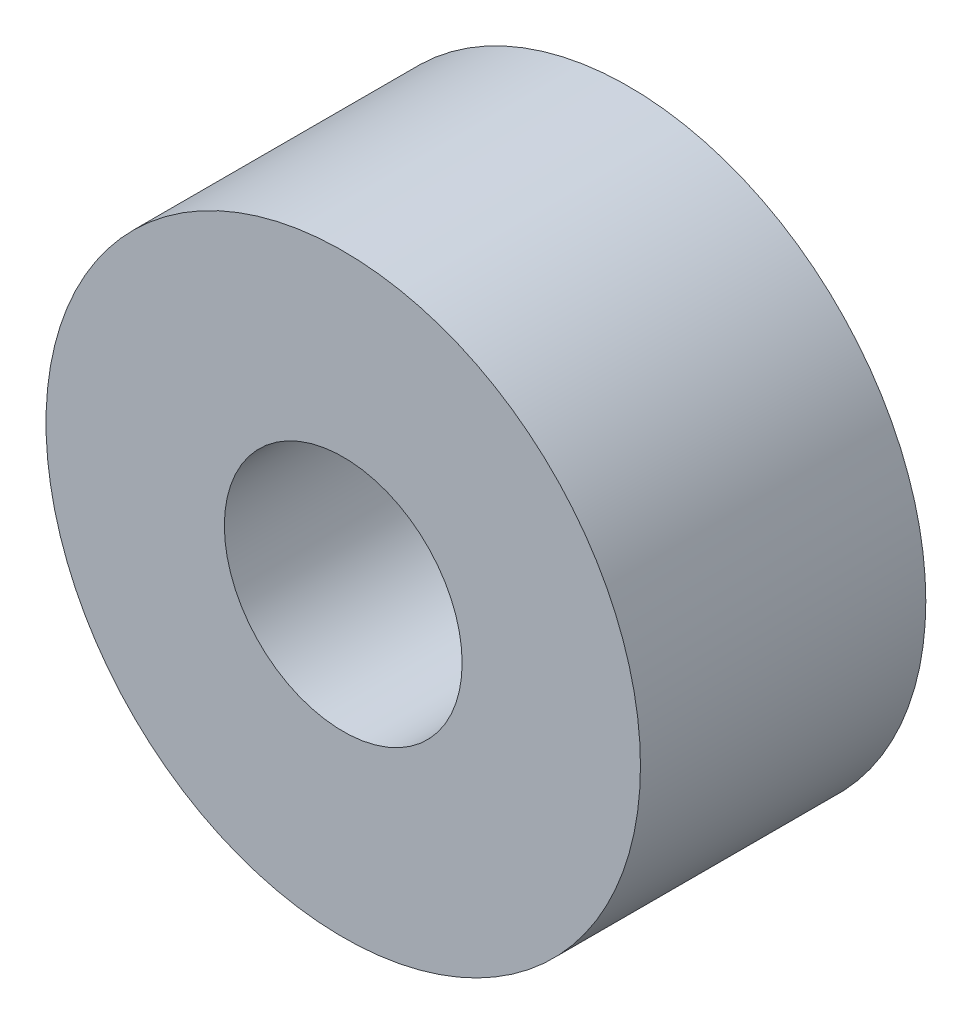
ISO-10303-21;
HEADER;
FILE_DESCRIPTION(('STEP AP214'),'2;1');
FILE_NAME('part.step','',(''),(''),'','','');
FILE_SCHEMA(('AUTOMOTIVE_DESIGN { 1 0 10303 214 1 1 1 1 }'));
ENDSEC;
DATA;
#1=APPLICATION_CONTEXT('core data for automotive mechanical design processes');
#2=APPLICATION_PROTOCOL_DEFINITION('international standard','automotive_design',2000,#1);
#3=PRODUCT_CONTEXT('',#1,'mechanical');
#4=PRODUCT('Part','Part','',(#3));
#5=PRODUCT_RELATED_PRODUCT_CATEGORY('part','',(#4));
#6=PRODUCT_DEFINITION_FORMATION('','',#4);
#7=PRODUCT_DEFINITION_CONTEXT('part definition',#1,'design');
#8=PRODUCT_DEFINITION('design','',#6,#7);
#9=PRODUCT_DEFINITION_SHAPE('','',#8);
#10=(LENGTH_UNIT() NAMED_UNIT(*) SI_UNIT(.MILLI.,.METRE.));
#11=(NAMED_UNIT(*) PLANE_ANGLE_UNIT() SI_UNIT($,.RADIAN.));
#12=(NAMED_UNIT(*) SI_UNIT($,.STERADIAN.) SOLID_ANGLE_UNIT());
#13=UNCERTAINTY_MEASURE_WITH_UNIT(LENGTH_MEASURE(1.E-05),#10,'distance_accuracy_value','');
#14=(GEOMETRIC_REPRESENTATION_CONTEXT(3) GLOBAL_UNCERTAINTY_ASSIGNED_CONTEXT((#13)) GLOBAL_UNIT_ASSIGNED_CONTEXT((#10,
#11,#12)) REPRESENTATION_CONTEXT('',''));
#15=CARTESIAN_POINT('',(0.,0.,0.));
#16=DIRECTION('',(0.,0.,1.));
#17=DIRECTION('',(1.,0.,0.));
#18=AXIS2_PLACEMENT_3D('',#15,#16,#17);
#19=CARTESIAN_POINT('',(12.5087,12.5087,0.00870000000009));
#20=DIRECTION('',(0.,0.,1.));
#21=DIRECTION('',(1.,0.,0.));
#22=AXIS2_PLACEMENT_3D('',#19,#20,#21);
#23=CYLINDRICAL_SURFACE('',#22,5.);
#24=CARTESIAN_POINT('',(12.5087,12.5087,0.00870000000009));
#25=DIRECTION('',(0.,0.,1.));
#26=DIRECTION('',(1.,0.,0.));
#27=AXIS2_PLACEMENT_3D('',#24,#25,#26);
#28=CIRCLE('',#27,5.);
#29=CARTESIAN_POINT('',(17.5087,12.5087,0.00870000000009));
#30=VERTEX_POINT('',#29);
#31=EDGE_CURVE('E25',#30,#30,#28,.F.);
#32=ORIENTED_EDGE('',*,*,#31,.T.);
#33=EDGE_LOOP('',(#32));
#34=FACE_BOUND('',#33,.T.);
#35=CARTESIAN_POINT('',(12.5087,12.5087,12.0087));
#36=DIRECTION('',(0.,0.,1.));
#37=DIRECTION('',(1.,0.,0.));
#38=AXIS2_PLACEMENT_3D('',#35,#36,#37);
#39=CIRCLE('',#38,5.);
#40=CARTESIAN_POINT('',(17.5087,12.5087,12.0087));
#41=VERTEX_POINT('',#40);
#42=EDGE_CURVE('E16',#41,#41,#39,.F.);
#43=ORIENTED_EDGE('',*,*,#42,.F.);
#44=EDGE_LOOP('',(#43));
#45=FACE_BOUND('',#44,.T.);
#46=ADVANCED_FACE('F13',(#34,#45),#23,.F.);
#47=CARTESIAN_POINT('',(12.5087,12.5087,12.0087));
#48=DIRECTION('',(0.,0.,1.));
#49=DIRECTION('',(1.,0.,0.));
#50=AXIS2_PLACEMENT_3D('',#47,#48,#49);
#51=PLANE('',#50);
#52=ORIENTED_EDGE('',*,*,#42,.T.);
#53=EDGE_LOOP('',(#52));
#54=FACE_BOUND('',#53,.T.);
#55=CARTESIAN_POINT('',(12.5087,12.5087,12.0087));
#56=DIRECTION('',(0.,0.,1.));
#57=DIRECTION('',(1.,0.,0.));
#58=AXIS2_PLACEMENT_3D('',#55,#56,#57);
#59=CIRCLE('',#58,12.5);
#60=CARTESIAN_POINT('',(25.0087,12.5087,12.0087));
#61=VERTEX_POINT('',#60);
#62=EDGE_CURVE('E20',#61,#61,#59,.F.);
#63=ORIENTED_EDGE('',*,*,#62,.F.);
#64=EDGE_LOOP('',(#63));
#65=FACE_BOUND('',#64,.T.);
#66=ADVANCED_FACE('F33',(#54,#65),#51,.T.);
#67=CARTESIAN_POINT('',(12.5087,12.5087,0.00870000000009));
#68=DIRECTION('',(0.,0.,1.));
#69=DIRECTION('',(1.,0.,0.));
#70=AXIS2_PLACEMENT_3D('',#67,#68,#69);
#71=PLANE('',#70);
#72=ORIENTED_EDGE('',*,*,#31,.F.);
#73=EDGE_LOOP('',(#72));
#74=FACE_BOUND('',#73,.T.);
#75=CARTESIAN_POINT('',(12.5087,12.5087,0.00870000000009));
#76=DIRECTION('',(0.,0.,1.));
#77=DIRECTION('',(1.,0.,0.));
#78=AXIS2_PLACEMENT_3D('',#75,#76,#77);
#79=CIRCLE('',#78,12.5);
#80=CARTESIAN_POINT('',(25.0087,12.5087,0.00870000000009));
#81=VERTEX_POINT('',#80);
#82=EDGE_CURVE('E8',#81,#81,#79,.T.);
#83=ORIENTED_EDGE('',*,*,#82,.F.);
#84=EDGE_LOOP('',(#83));
#85=FACE_BOUND('',#84,.T.);
#86=ADVANCED_FACE('F41',(#74,#85),#71,.F.);
#87=CARTESIAN_POINT('',(12.5087,12.5087,0.00870000000009));
#88=DIRECTION('',(0.,0.,1.));
#89=DIRECTION('',(1.,0.,0.));
#90=AXIS2_PLACEMENT_3D('',#87,#88,#89);
#91=CYLINDRICAL_SURFACE('',#90,12.5);
#92=ORIENTED_EDGE('',*,*,#82,.T.);
#93=EDGE_LOOP('',(#92));
#94=FACE_BOUND('',#93,.T.);
#95=ORIENTED_EDGE('',*,*,#62,.T.);
#96=EDGE_LOOP('',(#95));
#97=FACE_BOUND('',#96,.T.);
#98=ADVANCED_FACE('F42',(#94,#97),#91,.T.);
#99=CLOSED_SHELL('',(#46,#66,#86,#98));
#100=MANIFOLD_SOLID_BREP('B1',#99);
#101=ADVANCED_BREP_SHAPE_REPRESENTATION('',(#18,#100),#14);
#102=SHAPE_DEFINITION_REPRESENTATION(#9,#101);
ENDSEC;
END-ISO-10303-21;
